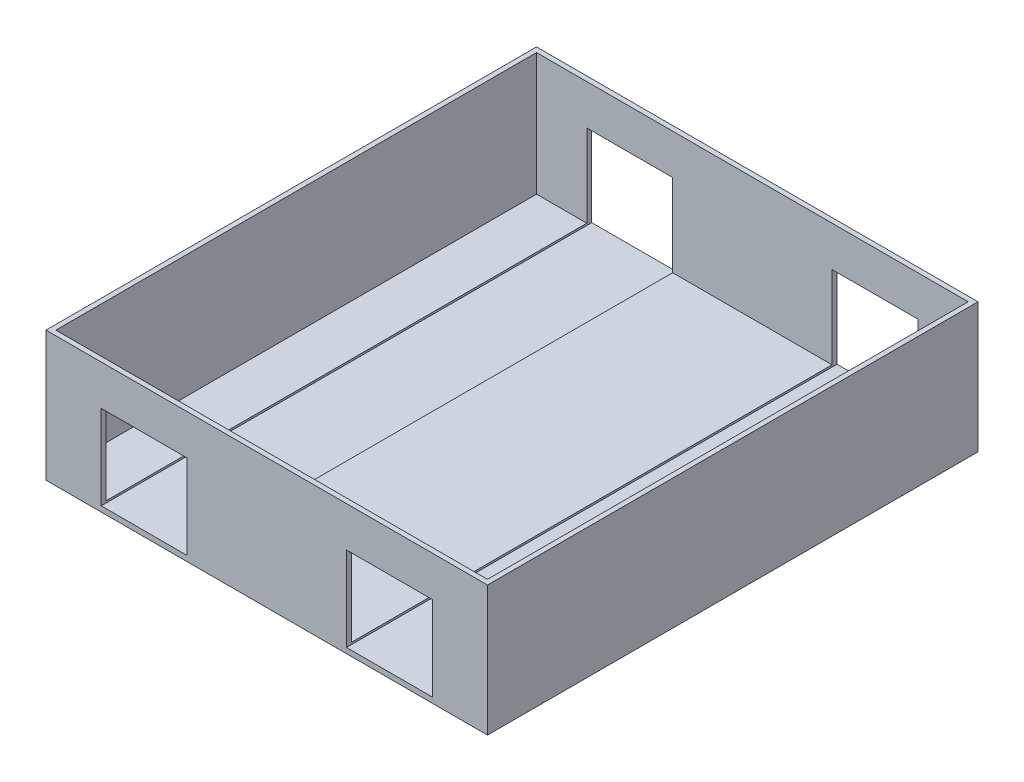
ISO-10303-21;
HEADER;
FILE_DESCRIPTION(('STEP AP214'),'2;1');
FILE_NAME('part.step','',(''),(''),'','','');
FILE_SCHEMA(('AUTOMOTIVE_DESIGN { 1 0 10303 214 1 1 1 1 }'));
ENDSEC;
DATA;
#1=APPLICATION_CONTEXT('core data for automotive mechanical design processes');
#2=APPLICATION_PROTOCOL_DEFINITION('international standard','automotive_design',2000,#1);
#3=PRODUCT_CONTEXT('',#1,'mechanical');
#4=PRODUCT('Part','Part','',(#3));
#5=PRODUCT_RELATED_PRODUCT_CATEGORY('part','',(#4));
#6=PRODUCT_DEFINITION_FORMATION('','',#4);
#7=PRODUCT_DEFINITION_CONTEXT('part definition',#1,'design');
#8=PRODUCT_DEFINITION('design','',#6,#7);
#9=PRODUCT_DEFINITION_SHAPE('','',#8);
#10=(LENGTH_UNIT() NAMED_UNIT(*) SI_UNIT(.MILLI.,.METRE.));
#11=(NAMED_UNIT(*) PLANE_ANGLE_UNIT() SI_UNIT($,.RADIAN.));
#12=(NAMED_UNIT(*) SI_UNIT($,.STERADIAN.) SOLID_ANGLE_UNIT());
#13=UNCERTAINTY_MEASURE_WITH_UNIT(LENGTH_MEASURE(1.E-05),#10,'distance_accuracy_value','');
#14=(GEOMETRIC_REPRESENTATION_CONTEXT(3) GLOBAL_UNCERTAINTY_ASSIGNED_CONTEXT((#13)) GLOBAL_UNIT_ASSIGNED_CONTEXT((#10,
#11,#12)) REPRESENTATION_CONTEXT('',''));
#15=CARTESIAN_POINT('',(0.,0.,0.));
#16=DIRECTION('',(0.,0.,1.));
#17=DIRECTION('',(1.,0.,0.));
#18=AXIS2_PLACEMENT_3D('',#15,#16,#17);
#19=CARTESIAN_POINT('',(-90.,3.,-100.));
#20=DIRECTION('',(0.,0.,1.));
#21=DIRECTION('',(1.,0.,0.));
#22=AXIS2_PLACEMENT_3D('',#19,#20,#21);
#23=PLANE('',#22);
#24=DIRECTION('',(0.,1.,0.));
#25=VECTOR('',#24,1.);
#26=CARTESIAN_POINT('',(67.492549271788,36.6349741182592,-100.));
#27=LINE('',#26,#25);
#28=CARTESIAN_POINT('',(67.492549271788,2.20000000000002,-100.));
#29=VERTEX_POINT('',#28);
#30=CARTESIAN_POINT('',(67.492549271788,36.6349741182592,-100.));
#31=VERTEX_POINT('',#30);
#32=EDGE_CURVE('E63',#29,#31,#27,.T.);
#33=ORIENTED_EDGE('',*,*,#32,.T.);
#34=DIRECTION('',(-1.,0.,0.));
#35=VECTOR('',#34,1.);
#36=CARTESIAN_POINT('',(67.492549271788,36.6349741182592,-100.));
#37=LINE('',#36,#35);
#38=CARTESIAN_POINT('',(32.507450728212,36.6349741182592,-100.));
#39=VERTEX_POINT('',#38);
#40=EDGE_CURVE('E264',#31,#39,#37,.T.);
#41=ORIENTED_EDGE('',*,*,#40,.T.);
#42=DIRECTION('',(0.,-1.,0.));
#43=VECTOR('',#42,1.);
#44=CARTESIAN_POINT('',(32.507450728212,36.6349741182592,-100.));
#45=LINE('',#44,#43);
#46=CARTESIAN_POINT('',(32.507450728212,2.20000000000001,-100.));
#47=VERTEX_POINT('',#46);
#48=EDGE_CURVE('E268',#39,#47,#45,.T.);
#49=ORIENTED_EDGE('',*,*,#48,.T.);
#50=DIRECTION('',(1.,0.,0.));
#51=VECTOR('',#50,1.);
#52=CARTESIAN_POINT('',(67.492549271788,2.20000000000002,-100.));
#53=LINE('',#52,#51);
#54=EDGE_CURVE('E272',#47,#29,#53,.T.);
#55=ORIENTED_EDGE('',*,*,#54,.T.);
#56=EDGE_LOOP('',(#33,#41,#49,#55));
#57=FACE_BOUND('',#56,.T.);
#58=DIRECTION('',(-1.,0.,0.));
#59=VECTOR('',#58,1.);
#60=CARTESIAN_POINT('',(-90.,0.,-100.));
#61=LINE('',#60,#59);
#62=CARTESIAN_POINT('',(90.,0.,-100.));
#63=VERTEX_POINT('',#62);
#64=CARTESIAN_POINT('',(-90.,0.,-100.));
#65=VERTEX_POINT('',#64);
#66=EDGE_CURVE('E406',#63,#65,#61,.T.);
#67=ORIENTED_EDGE('',*,*,#66,.T.);
#68=DIRECTION('',(0.,-1.,0.));
#69=VECTOR('',#68,1.);
#70=CARTESIAN_POINT('',(-90.,3.,-100.));
#71=LINE('',#70,#69);
#72=CARTESIAN_POINT('',(-90.,53.,-100.));
#73=VERTEX_POINT('',#72);
#74=EDGE_CURVE('E423',#73,#65,#71,.T.);
#75=ORIENTED_EDGE('',*,*,#74,.F.);
#76=DIRECTION('',(-1.,0.,0.));
#77=VECTOR('',#76,1.);
#78=CARTESIAN_POINT('',(90.,53.,-100.));
#79=LINE('',#78,#77);
#80=CARTESIAN_POINT('',(90.,53.,-100.));
#81=VERTEX_POINT('',#80);
#82=EDGE_CURVE('E394',#81,#73,#79,.T.);
#83=ORIENTED_EDGE('',*,*,#82,.F.);
#84=DIRECTION('',(0.,-1.,0.));
#85=VECTOR('',#84,1.);
#86=CARTESIAN_POINT('',(90.,3.,-100.));
#87=LINE('',#86,#85);
#88=EDGE_CURVE('E427',#81,#63,#87,.T.);
#89=ORIENTED_EDGE('',*,*,#88,.T.);
#90=EDGE_LOOP('',(#67,#75,#83,#89));
#91=FACE_BOUND('',#90,.T.);
#92=DIRECTION('',(0.,-1.,0.));
#93=VECTOR('',#92,1.);
#94=CARTESIAN_POINT('',(-67.492549271788,36.6349741182592,-100.));
#95=LINE('',#94,#93);
#96=CARTESIAN_POINT('',(-67.492549271788,36.6349741182592,-100.));
#97=VERTEX_POINT('',#96);
#98=CARTESIAN_POINT('',(-67.492549271788,2.2,-100.));
#99=VERTEX_POINT('',#98);
#100=EDGE_CURVE('E55',#97,#99,#95,.T.);
#101=ORIENTED_EDGE('',*,*,#100,.T.);
#102=DIRECTION('',(1.,0.,0.));
#103=VECTOR('',#102,1.);
#104=CARTESIAN_POINT('',(-67.492549271788,2.2,-100.));
#105=LINE('',#104,#103);
#106=CARTESIAN_POINT('',(-32.507450728212,2.2,-100.));
#107=VERTEX_POINT('',#106);
#108=EDGE_CURVE('E214',#99,#107,#105,.T.);
#109=ORIENTED_EDGE('',*,*,#108,.T.);
#110=DIRECTION('',(0.,1.,0.));
#111=VECTOR('',#110,1.);
#112=CARTESIAN_POINT('',(-32.507450728212,36.6349741182592,-100.));
#113=LINE('',#112,#111);
#114=CARTESIAN_POINT('',(-32.507450728212,36.6349741182592,-100.));
#115=VERTEX_POINT('',#114);
#116=EDGE_CURVE('E221',#107,#115,#113,.T.);
#117=ORIENTED_EDGE('',*,*,#116,.T.);
#118=DIRECTION('',(-1.,0.,0.));
#119=VECTOR('',#118,1.);
#120=CARTESIAN_POINT('',(-67.492549271788,36.6349741182592,-100.));
#121=LINE('',#120,#119);
#122=EDGE_CURVE('E225',#115,#97,#121,.T.);
#123=ORIENTED_EDGE('',*,*,#122,.T.);
#124=EDGE_LOOP('',(#101,#109,#117,#123));
#125=FACE_BOUND('',#124,.T.);
#126=ADVANCED_FACE('F39',(#57,#91,#125),#23,.F.);
#127=CARTESIAN_POINT('',(-90.,3.,100.));
#128=DIRECTION('',(0.,0.,-1.));
#129=DIRECTION('',(-1.,0.,0.));
#130=AXIS2_PLACEMENT_3D('',#127,#128,#129);
#131=PLANE('',#130);
#132=DIRECTION('',(0.,1.,0.));
#133=VECTOR('',#132,1.);
#134=CARTESIAN_POINT('',(67.492549271788,36.6349741182592,100.));
#135=LINE('',#134,#133);
#136=CARTESIAN_POINT('',(67.492549271788,2.20000000000002,100.));
#137=VERTEX_POINT('',#136);
#138=CARTESIAN_POINT('',(67.492549271788,36.6349741182592,100.));
#139=VERTEX_POINT('',#138);
#140=EDGE_CURVE('E276',#137,#139,#135,.T.);
#141=ORIENTED_EDGE('',*,*,#140,.F.);
#142=DIRECTION('',(1.,0.,0.));
#143=VECTOR('',#142,1.);
#144=CARTESIAN_POINT('',(67.492549271788,2.20000000000002,100.));
#145=LINE('',#144,#143);
#146=CARTESIAN_POINT('',(32.507450728212,2.20000000000001,100.));
#147=VERTEX_POINT('',#146);
#148=EDGE_CURVE('E286',#147,#137,#145,.T.);
#149=ORIENTED_EDGE('',*,*,#148,.F.);
#150=DIRECTION('',(0.,-1.,0.));
#151=VECTOR('',#150,1.);
#152=CARTESIAN_POINT('',(32.507450728212,36.6349741182592,100.));
#153=LINE('',#152,#151);
#154=CARTESIAN_POINT('',(32.507450728212,36.6349741182592,100.));
#155=VERTEX_POINT('',#154);
#156=EDGE_CURVE('E282',#155,#147,#153,.T.);
#157=ORIENTED_EDGE('',*,*,#156,.F.);
#158=DIRECTION('',(-1.,0.,0.));
#159=VECTOR('',#158,1.);
#160=CARTESIAN_POINT('',(67.492549271788,36.6349741182592,100.));
#161=LINE('',#160,#159);
#162=EDGE_CURVE('E279',#139,#155,#161,.T.);
#163=ORIENTED_EDGE('',*,*,#162,.F.);
#164=EDGE_LOOP('',(#141,#149,#157,#163));
#165=FACE_BOUND('',#164,.T.);
#166=DIRECTION('',(1.,0.,0.));
#167=VECTOR('',#166,1.);
#168=CARTESIAN_POINT('',(-90.,0.,100.));
#169=LINE('',#168,#167);
#170=CARTESIAN_POINT('',(-90.,0.,100.));
#171=VERTEX_POINT('',#170);
#172=CARTESIAN_POINT('',(90.,0.,100.));
#173=VERTEX_POINT('',#172);
#174=EDGE_CURVE('E412',#171,#173,#169,.T.);
#175=ORIENTED_EDGE('',*,*,#174,.T.);
#176=DIRECTION('',(0.,-1.,0.));
#177=VECTOR('',#176,1.);
#178=CARTESIAN_POINT('',(90.,3.,100.));
#179=LINE('',#178,#177);
#180=CARTESIAN_POINT('',(90.,53.,100.));
#181=VERTEX_POINT('',#180);
#182=EDGE_CURVE('E415',#181,#173,#179,.T.);
#183=ORIENTED_EDGE('',*,*,#182,.F.);
#184=DIRECTION('',(1.,0.,0.));
#185=VECTOR('',#184,1.);
#186=CARTESIAN_POINT('',(-90.,53.,100.));
#187=LINE('',#186,#185);
#188=CARTESIAN_POINT('',(-90.,53.,100.));
#189=VERTEX_POINT('',#188);
#190=EDGE_CURVE('E386',#189,#181,#187,.T.);
#191=ORIENTED_EDGE('',*,*,#190,.F.);
#192=DIRECTION('',(0.,-1.,0.));
#193=VECTOR('',#192,1.);
#194=CARTESIAN_POINT('',(-90.,3.,100.));
#195=LINE('',#194,#193);
#196=EDGE_CURVE('E419',#189,#171,#195,.T.);
#197=ORIENTED_EDGE('',*,*,#196,.T.);
#198=EDGE_LOOP('',(#175,#183,#191,#197));
#199=FACE_BOUND('',#198,.T.);
#200=DIRECTION('',(0.,-1.,0.));
#201=VECTOR('',#200,1.);
#202=CARTESIAN_POINT('',(-67.492549271788,36.6349741182592,100.));
#203=LINE('',#202,#201);
#204=CARTESIAN_POINT('',(-67.492549271788,36.6349741182592,100.));
#205=VERTEX_POINT('',#204);
#206=CARTESIAN_POINT('',(-67.492549271788,2.2,100.));
#207=VERTEX_POINT('',#206);
#208=EDGE_CURVE('E206',#205,#207,#203,.T.);
#209=ORIENTED_EDGE('',*,*,#208,.F.);
#210=DIRECTION('',(-1.,0.,0.));
#211=VECTOR('',#210,1.);
#212=CARTESIAN_POINT('',(-67.492549271788,36.6349741182592,100.));
#213=LINE('',#212,#211);
#214=CARTESIAN_POINT('',(-32.507450728212,36.6349741182592,100.));
#215=VERTEX_POINT('',#214);
#216=EDGE_CURVE('E247',#215,#205,#213,.T.);
#217=ORIENTED_EDGE('',*,*,#216,.F.);
#218=DIRECTION('',(0.,1.,0.));
#219=VECTOR('',#218,1.);
#220=CARTESIAN_POINT('',(-32.507450728212,36.6349741182592,100.));
#221=LINE('',#220,#219);
#222=CARTESIAN_POINT('',(-32.507450728212,2.2,100.));
#223=VERTEX_POINT('',#222);
#224=EDGE_CURVE('E243',#223,#215,#221,.T.);
#225=ORIENTED_EDGE('',*,*,#224,.F.);
#226=DIRECTION('',(1.,0.,0.));
#227=VECTOR('',#226,1.);
#228=CARTESIAN_POINT('',(-67.492549271788,2.2,100.));
#229=LINE('',#228,#227);
#230=EDGE_CURVE('E240',#207,#223,#229,.T.);
#231=ORIENTED_EDGE('',*,*,#230,.F.);
#232=EDGE_LOOP('',(#209,#217,#225,#231));
#233=FACE_BOUND('',#232,.T.);
#234=ADVANCED_FACE('F462',(#165,#199,#233),#131,.F.);
#235=CARTESIAN_POINT('',(88.,53.,-98.));
#236=DIRECTION('',(0.,0.,1.));
#237=DIRECTION('',(1.,0.,0.));
#238=AXIS2_PLACEMENT_3D('',#235,#236,#237);
#239=PLANE('',#238);
#240=DIRECTION('',(-1.,0.,0.));
#241=VECTOR('',#240,1.);
#242=CARTESIAN_POINT('',(88.,3.,-98.));
#243=LINE('',#242,#241);
#244=CARTESIAN_POINT('',(-67.492549271788,3.,-98.));
#245=VERTEX_POINT('',#244);
#246=CARTESIAN_POINT('',(-88.,3.,-98.));
#247=VERTEX_POINT('',#246);
#248=EDGE_CURVE('E339',#245,#247,#243,.T.);
#249=ORIENTED_EDGE('',*,*,#248,.F.);
#250=DIRECTION('',(0.,1.,0.));
#251=VECTOR('',#250,1.);
#252=CARTESIAN_POINT('',(-67.492549271788,53.,-98.));
#253=LINE('',#252,#251);
#254=CARTESIAN_POINT('',(-67.492549271788,36.6349741182592,-98.));
#255=VERTEX_POINT('',#254);
#256=EDGE_CURVE('E327',#245,#255,#253,.T.);
#257=ORIENTED_EDGE('',*,*,#256,.T.);
#258=DIRECTION('',(1.,0.,0.));
#259=VECTOR('',#258,1.);
#260=CARTESIAN_POINT('',(88.,36.6349741182592,-98.));
#261=LINE('',#260,#259);
#262=CARTESIAN_POINT('',(-32.507450728212,36.6349741182592,-98.));
#263=VERTEX_POINT('',#262);
#264=EDGE_CURVE('E335',#255,#263,#261,.T.);
#265=ORIENTED_EDGE('',*,*,#264,.T.);
#266=DIRECTION('',(0.,-1.,0.));
#267=VECTOR('',#266,1.);
#268=CARTESIAN_POINT('',(-32.507450728212,53.,-98.));
#269=LINE('',#268,#267);
#270=CARTESIAN_POINT('',(-32.507450728212,3.,-98.));
#271=VERTEX_POINT('',#270);
#272=EDGE_CURVE('E319',#263,#271,#269,.T.);
#273=ORIENTED_EDGE('',*,*,#272,.T.);
#274=CARTESIAN_POINT('',(32.507450728212,3.,-98.));
#275=VERTEX_POINT('',#274);
#276=EDGE_CURVE('E360',#275,#271,#243,.T.);
#277=ORIENTED_EDGE('',*,*,#276,.F.);
#278=DIRECTION('',(0.,1.,0.));
#279=VECTOR('',#278,1.);
#280=CARTESIAN_POINT('',(32.507450728212,53.,-98.));
#281=LINE('',#280,#279);
#282=CARTESIAN_POINT('',(32.507450728212,36.6349741182592,-98.));
#283=VERTEX_POINT('',#282);
#284=EDGE_CURVE('E303',#275,#283,#281,.T.);
#285=ORIENTED_EDGE('',*,*,#284,.T.);
#286=DIRECTION('',(1.,0.,0.));
#287=VECTOR('',#286,1.);
#288=CARTESIAN_POINT('',(88.,36.6349741182592,-98.));
#289=LINE('',#288,#287);
#290=CARTESIAN_POINT('',(67.492549271788,36.6349741182592,-98.));
#291=VERTEX_POINT('',#290);
#292=EDGE_CURVE('E331',#283,#291,#289,.T.);
#293=ORIENTED_EDGE('',*,*,#292,.T.);
#294=DIRECTION('',(0.,-1.,0.));
#295=VECTOR('',#294,1.);
#296=CARTESIAN_POINT('',(67.492549271788,53.,-98.));
#297=LINE('',#296,#295);
#298=CARTESIAN_POINT('',(67.492549271788,3.,-98.));
#299=VERTEX_POINT('',#298);
#300=EDGE_CURVE('E311',#291,#299,#297,.T.);
#301=ORIENTED_EDGE('',*,*,#300,.T.);
#302=CARTESIAN_POINT('',(88.,3.,-98.));
#303=VERTEX_POINT('',#302);
#304=EDGE_CURVE('E355',#303,#299,#243,.T.);
#305=ORIENTED_EDGE('',*,*,#304,.F.);
#306=DIRECTION('',(0.,-1.,0.));
#307=VECTOR('',#306,1.);
#308=CARTESIAN_POINT('',(88.,53.,-98.));
#309=LINE('',#308,#307);
#310=CARTESIAN_POINT('',(88.,53.,-98.));
#311=VERTEX_POINT('',#310);
#312=EDGE_CURVE('E354',#311,#303,#309,.T.);
#313=ORIENTED_EDGE('',*,*,#312,.F.);
#314=DIRECTION('',(-1.,0.,0.));
#315=VECTOR('',#314,1.);
#316=CARTESIAN_POINT('',(88.,53.,-98.));
#317=LINE('',#316,#315);
#318=CARTESIAN_POINT('',(-88.,53.,-98.));
#319=VERTEX_POINT('',#318);
#320=EDGE_CURVE('E340',#311,#319,#317,.T.);
#321=ORIENTED_EDGE('',*,*,#320,.T.);
#322=DIRECTION('',(0.,-1.,0.));
#323=VECTOR('',#322,1.);
#324=CARTESIAN_POINT('',(-88.,53.,-98.));
#325=LINE('',#324,#323);
#326=EDGE_CURVE('E382',#319,#247,#325,.T.);
#327=ORIENTED_EDGE('',*,*,#326,.T.);
#328=EDGE_LOOP('',(#249,#257,#265,#273,#277,#285,#293,#301,#305,#313,#321,#327));
#329=FACE_BOUND('',#328,.T.);
#330=ADVANCED_FACE('F474',(#329),#239,.T.);
#331=CARTESIAN_POINT('',(-88.,53.,98.));
#332=DIRECTION('',(0.,0.,-1.));
#333=DIRECTION('',(-1.,0.,0.));
#334=AXIS2_PLACEMENT_3D('',#331,#332,#333);
#335=PLANE('',#334);
#336=DIRECTION('',(-1.,0.,0.));
#337=VECTOR('',#336,1.);
#338=CARTESIAN_POINT('',(-88.,36.6349741182592,98.));
#339=LINE('',#338,#337);
#340=CARTESIAN_POINT('',(-32.507450728212,36.6349741182592,98.));
#341=VERTEX_POINT('',#340);
#342=CARTESIAN_POINT('',(-67.492549271788,36.6349741182592,98.));
#343=VERTEX_POINT('',#342);
#344=EDGE_CURVE('E11',#341,#343,#339,.T.);
#345=ORIENTED_EDGE('',*,*,#344,.T.);
#346=DIRECTION('',(0.,-1.,0.));
#347=VECTOR('',#346,1.);
#348=CARTESIAN_POINT('',(-67.492549271788,53.,98.));
#349=LINE('',#348,#347);
#350=CARTESIAN_POINT('',(-67.492549271788,3.,98.));
#351=VERTEX_POINT('',#350);
#352=EDGE_CURVE('E323',#343,#351,#349,.T.);
#353=ORIENTED_EDGE('',*,*,#352,.T.);
#354=DIRECTION('',(1.,0.,0.));
#355=VECTOR('',#354,1.);
#356=CARTESIAN_POINT('',(-88.,3.,98.));
#357=LINE('',#356,#355);
#358=CARTESIAN_POINT('',(-88.,3.,98.));
#359=VERTEX_POINT('',#358);
#360=EDGE_CURVE('E364',#359,#351,#357,.T.);
#361=ORIENTED_EDGE('',*,*,#360,.F.);
#362=DIRECTION('',(0.,-1.,0.));
#363=VECTOR('',#362,1.);
#364=CARTESIAN_POINT('',(-88.,53.,98.));
#365=LINE('',#364,#363);
#366=CARTESIAN_POINT('',(-88.,53.,98.));
#367=VERTEX_POINT('',#366);
#368=EDGE_CURVE('E378',#367,#359,#365,.T.);
#369=ORIENTED_EDGE('',*,*,#368,.F.);
#370=DIRECTION('',(1.,0.,0.));
#371=VECTOR('',#370,1.);
#372=CARTESIAN_POINT('',(-88.,53.,98.));
#373=LINE('',#372,#371);
#374=CARTESIAN_POINT('',(88.,53.,98.));
#375=VERTEX_POINT('',#374);
#376=EDGE_CURVE('E347',#367,#375,#373,.T.);
#377=ORIENTED_EDGE('',*,*,#376,.T.);
#378=DIRECTION('',(0.,-1.,0.));
#379=VECTOR('',#378,1.);
#380=CARTESIAN_POINT('',(88.,53.,98.));
#381=LINE('',#380,#379);
#382=CARTESIAN_POINT('',(88.,3.,98.));
#383=VERTEX_POINT('',#382);
#384=EDGE_CURVE('E374',#375,#383,#381,.T.);
#385=ORIENTED_EDGE('',*,*,#384,.T.);
#386=CARTESIAN_POINT('',(67.492549271788,3.,98.));
#387=VERTEX_POINT('',#386);
#388=EDGE_CURVE('E363',#387,#383,#357,.T.);
#389=ORIENTED_EDGE('',*,*,#388,.F.);
#390=DIRECTION('',(0.,1.,0.));
#391=VECTOR('',#390,1.);
#392=CARTESIAN_POINT('',(67.492549271788,53.,98.));
#393=LINE('',#392,#391);
#394=CARTESIAN_POINT('',(67.492549271788,36.6349741182592,98.));
#395=VERTEX_POINT('',#394);
#396=EDGE_CURVE('E307',#387,#395,#393,.T.);
#397=ORIENTED_EDGE('',*,*,#396,.T.);
#398=DIRECTION('',(-1.,0.,0.));
#399=VECTOR('',#398,1.);
#400=CARTESIAN_POINT('',(-88.,36.6349741182592,98.));
#401=LINE('',#400,#399);
#402=CARTESIAN_POINT('',(32.507450728212,36.6349741182592,98.));
#403=VERTEX_POINT('',#402);
#404=EDGE_CURVE('E48',#395,#403,#401,.T.);
#405=ORIENTED_EDGE('',*,*,#404,.T.);
#406=DIRECTION('',(0.,-1.,0.));
#407=VECTOR('',#406,1.);
#408=CARTESIAN_POINT('',(32.507450728212,53.,98.));
#409=LINE('',#408,#407);
#410=CARTESIAN_POINT('',(32.507450728212,3.,98.));
#411=VERTEX_POINT('',#410);
#412=EDGE_CURVE('E210',#403,#411,#409,.T.);
#413=ORIENTED_EDGE('',*,*,#412,.T.);
#414=CARTESIAN_POINT('',(-32.507450728212,3.,98.));
#415=VERTEX_POINT('',#414);
#416=EDGE_CURVE('E368',#415,#411,#357,.T.);
#417=ORIENTED_EDGE('',*,*,#416,.F.);
#418=DIRECTION('',(0.,1.,0.));
#419=VECTOR('',#418,1.);
#420=CARTESIAN_POINT('',(-32.507450728212,53.,98.));
#421=LINE('',#420,#419);
#422=EDGE_CURVE('E315',#415,#341,#421,.T.);
#423=ORIENTED_EDGE('',*,*,#422,.T.);
#424=EDGE_LOOP('',(#345,#353,#361,#369,#377,#385,#389,#397,#405,#413,#417,#423));
#425=FACE_BOUND('',#424,.T.);
#426=ADVANCED_FACE('F449',(#425),#335,.T.);
#427=CARTESIAN_POINT('',(0.,3.,0.));
#428=DIRECTION('',(0.,1.,0.));
#429=DIRECTION('',(0.,0.,1.));
#430=AXIS2_PLACEMENT_3D('',#427,#428,#429);
#431=PLANE('',#430);
#432=ORIENTED_EDGE('',*,*,#360,.T.);
#433=DIRECTION('',(0.,0.,-1.));
#434=VECTOR('',#433,1.);
#435=CARTESIAN_POINT('',(-67.492549271788,3.,0.));
#436=LINE('',#435,#434);
#437=EDGE_CURVE('E443',#351,#245,#436,.T.);
#438=ORIENTED_EDGE('',*,*,#437,.T.);
#439=ORIENTED_EDGE('',*,*,#248,.T.);
#440=DIRECTION('',(0.,0.,1.));
#441=VECTOR('',#440,1.);
#442=CARTESIAN_POINT('',(-88.,3.,-98.));
#443=LINE('',#442,#441);
#444=EDGE_CURVE('E359',#247,#359,#443,.T.);
#445=ORIENTED_EDGE('',*,*,#444,.T.);
#446=EDGE_LOOP('',(#432,#438,#439,#445));
#447=FACE_BOUND('',#446,.T.);
#448=ADVANCED_FACE('F479',(#447),#431,.T.);
#449=ORIENTED_EDGE('',*,*,#276,.T.);
#450=DIRECTION('',(0.,0.,1.));
#451=VECTOR('',#450,1.);
#452=CARTESIAN_POINT('',(-32.507450728212,3.,0.));
#453=LINE('',#452,#451);
#454=EDGE_CURVE('E439',#271,#415,#453,.T.);
#455=ORIENTED_EDGE('',*,*,#454,.T.);
#456=ORIENTED_EDGE('',*,*,#416,.T.);
#457=DIRECTION('',(0.,0.,-1.));
#458=VECTOR('',#457,1.);
#459=CARTESIAN_POINT('',(32.507450728212,3.,0.));
#460=LINE('',#459,#458);
#461=EDGE_CURVE('E431',#411,#275,#460,.T.);
#462=ORIENTED_EDGE('',*,*,#461,.T.);
#463=EDGE_LOOP('',(#449,#455,#456,#462));
#464=FACE_BOUND('',#463,.T.);
#465=ADVANCED_FACE('F471',(#464),#431,.T.);
#466=ORIENTED_EDGE('',*,*,#304,.T.);
#467=DIRECTION('',(0.,0.,1.));
#468=VECTOR('',#467,1.);
#469=CARTESIAN_POINT('',(67.492549271788,3.,0.));
#470=LINE('',#469,#468);
#471=EDGE_CURVE('E435',#299,#387,#470,.T.);
#472=ORIENTED_EDGE('',*,*,#471,.T.);
#473=ORIENTED_EDGE('',*,*,#388,.T.);
#474=DIRECTION('',(0.,0.,-1.));
#475=VECTOR('',#474,1.);
#476=CARTESIAN_POINT('',(88.,3.,98.));
#477=LINE('',#476,#475);
#478=EDGE_CURVE('E344',#383,#303,#477,.T.);
#479=ORIENTED_EDGE('',*,*,#478,.T.);
#480=EDGE_LOOP('',(#466,#472,#473,#479));
#481=FACE_BOUND('',#480,.T.);
#482=ADVANCED_FACE('F535',(#481),#431,.T.);
#483=CARTESIAN_POINT('',(90.,3.,-100.));
#484=DIRECTION('',(-1.,0.,0.));
#485=DIRECTION('',(0.,0.,1.));
#486=AXIS2_PLACEMENT_3D('',#483,#484,#485);
#487=PLANE('',#486);
#488=DIRECTION('',(0.,0.,-1.));
#489=VECTOR('',#488,1.);
#490=CARTESIAN_POINT('',(90.,0.,-100.));
#491=LINE('',#490,#489);
#492=EDGE_CURVE('E402',#173,#63,#491,.T.);
#493=ORIENTED_EDGE('',*,*,#492,.T.);
#494=ORIENTED_EDGE('',*,*,#88,.F.);
#495=DIRECTION('',(0.,0.,-1.));
#496=VECTOR('',#495,1.);
#497=CARTESIAN_POINT('',(90.,53.,100.));
#498=LINE('',#497,#496);
#499=EDGE_CURVE('E390',#181,#81,#498,.T.);
#500=ORIENTED_EDGE('',*,*,#499,.F.);
#501=ORIENTED_EDGE('',*,*,#182,.T.);
#502=EDGE_LOOP('',(#493,#494,#500,#501));
#503=FACE_BOUND('',#502,.T.);
#504=ADVANCED_FACE('F41',(#503),#487,.F.);
#505=CARTESIAN_POINT('',(-90.,3.,-100.));
#506=DIRECTION('',(1.,0.,0.));
#507=DIRECTION('',(0.,0.,-1.));
#508=AXIS2_PLACEMENT_3D('',#505,#506,#507);
#509=PLANE('',#508);
#510=DIRECTION('',(0.,0.,1.));
#511=VECTOR('',#510,1.);
#512=CARTESIAN_POINT('',(-90.,0.,-100.));
#513=LINE('',#512,#511);
#514=EDGE_CURVE('E409',#65,#171,#513,.T.);
#515=ORIENTED_EDGE('',*,*,#514,.T.);
#516=ORIENTED_EDGE('',*,*,#196,.F.);
#517=DIRECTION('',(0.,0.,1.));
#518=VECTOR('',#517,1.);
#519=CARTESIAN_POINT('',(-90.,53.,-100.));
#520=LINE('',#519,#518);
#521=EDGE_CURVE('E398',#73,#189,#520,.T.);
#522=ORIENTED_EDGE('',*,*,#521,.F.);
#523=ORIENTED_EDGE('',*,*,#74,.T.);
#524=EDGE_LOOP('',(#515,#516,#522,#523));
#525=FACE_BOUND('',#524,.T.);
#526=ADVANCED_FACE('F525',(#525),#509,.F.);
#527=CARTESIAN_POINT('',(0.,0.,0.));
#528=DIRECTION('',(0.,1.,0.));
#529=DIRECTION('',(0.,0.,1.));
#530=AXIS2_PLACEMENT_3D('',#527,#528,#529);
#531=PLANE('',#530);
#532=ORIENTED_EDGE('',*,*,#492,.F.);
#533=ORIENTED_EDGE('',*,*,#174,.F.);
#534=ORIENTED_EDGE('',*,*,#514,.F.);
#535=ORIENTED_EDGE('',*,*,#66,.F.);
#536=EDGE_LOOP('',(#532,#533,#534,#535));
#537=FACE_BOUND('',#536,.T.);
#538=ADVANCED_FACE('F527',(#537),#531,.F.);
#539=CARTESIAN_POINT('',(0.,53.,0.));
#540=DIRECTION('',(0.,1.,0.));
#541=DIRECTION('',(0.,0.,1.));
#542=AXIS2_PLACEMENT_3D('',#539,#540,#541);
#543=PLANE('',#542);
#544=ORIENTED_EDGE('',*,*,#190,.T.);
#545=ORIENTED_EDGE('',*,*,#499,.T.);
#546=ORIENTED_EDGE('',*,*,#82,.T.);
#547=ORIENTED_EDGE('',*,*,#521,.T.);
#548=EDGE_LOOP('',(#544,#545,#546,#547));
#549=FACE_BOUND('',#548,.T.);
#550=DIRECTION('',(0.,0.,1.));
#551=VECTOR('',#550,1.);
#552=CARTESIAN_POINT('',(-88.,53.,-98.));
#553=LINE('',#552,#551);
#554=EDGE_CURVE('E343',#319,#367,#553,.T.);
#555=ORIENTED_EDGE('',*,*,#554,.F.);
#556=ORIENTED_EDGE('',*,*,#320,.F.);
#557=DIRECTION('',(0.,0.,-1.));
#558=VECTOR('',#557,1.);
#559=CARTESIAN_POINT('',(88.,53.,98.));
#560=LINE('',#559,#558);
#561=EDGE_CURVE('E351',#375,#311,#560,.T.);
#562=ORIENTED_EDGE('',*,*,#561,.F.);
#563=ORIENTED_EDGE('',*,*,#376,.F.);
#564=EDGE_LOOP('',(#555,#556,#562,#563));
#565=FACE_BOUND('',#564,.T.);
#566=ADVANCED_FACE('F491',(#549,#565),#543,.T.);
#567=CARTESIAN_POINT('',(-88.,53.,-98.));
#568=DIRECTION('',(1.,0.,0.));
#569=DIRECTION('',(0.,0.,-1.));
#570=AXIS2_PLACEMENT_3D('',#567,#568,#569);
#571=PLANE('',#570);
#572=ORIENTED_EDGE('',*,*,#444,.F.);
#573=ORIENTED_EDGE('',*,*,#326,.F.);
#574=ORIENTED_EDGE('',*,*,#554,.T.);
#575=ORIENTED_EDGE('',*,*,#368,.T.);
#576=EDGE_LOOP('',(#572,#573,#574,#575));
#577=FACE_BOUND('',#576,.T.);
#578=ADVANCED_FACE('F482',(#577),#571,.T.);
#579=CARTESIAN_POINT('',(88.,53.,98.));
#580=DIRECTION('',(-1.,0.,0.));
#581=DIRECTION('',(0.,0.,1.));
#582=AXIS2_PLACEMENT_3D('',#579,#580,#581);
#583=PLANE('',#582);
#584=ORIENTED_EDGE('',*,*,#478,.F.);
#585=ORIENTED_EDGE('',*,*,#384,.F.);
#586=ORIENTED_EDGE('',*,*,#561,.T.);
#587=ORIENTED_EDGE('',*,*,#312,.T.);
#588=EDGE_LOOP('',(#584,#585,#586,#587));
#589=FACE_BOUND('',#588,.T.);
#590=ADVANCED_FACE('F543',(#589),#583,.T.);
#591=CARTESIAN_POINT('',(67.492549271788,36.6349741182592,100.));
#592=DIRECTION('',(0.,-1.,0.));
#593=DIRECTION('',(1.,0.,0.));
#594=AXIS2_PLACEMENT_3D('',#591,#592,#593);
#595=PLANE('',#594);
#596=DIRECTION('',(0.,0.,-1.));
#597=VECTOR('',#596,1.);
#598=CARTESIAN_POINT('',(32.507450728212,36.6349741182592,100.));
#599=LINE('',#598,#597);
#600=EDGE_CURVE('E295',#283,#39,#599,.T.);
#601=ORIENTED_EDGE('',*,*,#600,.T.);
#602=ORIENTED_EDGE('',*,*,#40,.F.);
#603=DIRECTION('',(0.,0.,-1.));
#604=VECTOR('',#603,1.);
#605=CARTESIAN_POINT('',(67.492549271788,36.6349741182592,100.));
#606=LINE('',#605,#604);
#607=EDGE_CURVE('E231',#291,#31,#606,.T.);
#608=ORIENTED_EDGE('',*,*,#607,.F.);
#609=ORIENTED_EDGE('',*,*,#292,.F.);
#610=EDGE_LOOP('',(#601,#602,#608,#609));
#611=FACE_BOUND('',#610,.T.);
#612=ADVANCED_FACE('F548',(#611),#595,.T.);
#613=CARTESIAN_POINT('',(67.492549271788,36.6349741182592,100.));
#614=DIRECTION('',(-1.,0.,0.));
#615=DIRECTION('',(0.,0.,1.));
#616=AXIS2_PLACEMENT_3D('',#613,#614,#615);
#617=PLANE('',#616);
#618=ORIENTED_EDGE('',*,*,#607,.T.);
#619=ORIENTED_EDGE('',*,*,#32,.F.);
#620=DIRECTION('',(0.,0.,-1.));
#621=VECTOR('',#620,1.);
#622=CARTESIAN_POINT('',(67.492549271788,2.20000000000002,100.));
#623=LINE('',#622,#621);
#624=EDGE_CURVE('E289',#137,#29,#623,.T.);
#625=ORIENTED_EDGE('',*,*,#624,.F.);
#626=ORIENTED_EDGE('',*,*,#140,.T.);
#627=EDGE_CURVE('E227',#139,#395,#606,.T.);
#628=ORIENTED_EDGE('',*,*,#627,.T.);
#629=ORIENTED_EDGE('',*,*,#396,.F.);
#630=ORIENTED_EDGE('',*,*,#471,.F.);
#631=ORIENTED_EDGE('',*,*,#300,.F.);
#632=EDGE_LOOP('',(#618,#619,#625,#626,#628,#629,#630,#631));
#633=FACE_BOUND('',#632,.T.);
#634=ADVANCED_FACE('F458',(#633),#617,.T.);
#635=ORIENTED_EDGE('',*,*,#627,.F.);
#636=ORIENTED_EDGE('',*,*,#162,.T.);
#637=EDGE_CURVE('E296',#155,#403,#599,.T.);
#638=ORIENTED_EDGE('',*,*,#637,.T.);
#639=ORIENTED_EDGE('',*,*,#404,.F.);
#640=EDGE_LOOP('',(#635,#636,#638,#639));
#641=FACE_BOUND('',#640,.T.);
#642=ADVANCED_FACE('F455',(#641),#595,.T.);
#643=CARTESIAN_POINT('',(32.507450728212,36.6349741182592,100.));
#644=DIRECTION('',(1.,0.,0.));
#645=DIRECTION('',(0.,1.,0.));
#646=AXIS2_PLACEMENT_3D('',#643,#644,#645);
#647=PLANE('',#646);
#648=ORIENTED_EDGE('',*,*,#461,.F.);
#649=ORIENTED_EDGE('',*,*,#412,.F.);
#650=ORIENTED_EDGE('',*,*,#637,.F.);
#651=ORIENTED_EDGE('',*,*,#156,.T.);
#652=DIRECTION('',(0.,0.,-1.));
#653=VECTOR('',#652,1.);
#654=CARTESIAN_POINT('',(32.507450728212,2.20000000000001,100.));
#655=LINE('',#654,#653);
#656=EDGE_CURVE('E292',#147,#47,#655,.T.);
#657=ORIENTED_EDGE('',*,*,#656,.T.);
#658=ORIENTED_EDGE('',*,*,#48,.F.);
#659=ORIENTED_EDGE('',*,*,#600,.F.);
#660=ORIENTED_EDGE('',*,*,#284,.F.);
#661=EDGE_LOOP('',(#648,#649,#650,#651,#657,#658,#659,#660));
#662=FACE_BOUND('',#661,.T.);
#663=ADVANCED_FACE('F466',(#662),#647,.T.);
#664=CARTESIAN_POINT('',(67.492549271788,2.20000000000002,100.));
#665=DIRECTION('',(0.,1.,0.));
#666=DIRECTION('',(-1.,0.,0.));
#667=AXIS2_PLACEMENT_3D('',#664,#665,#666);
#668=PLANE('',#667);
#669=ORIENTED_EDGE('',*,*,#656,.F.);
#670=ORIENTED_EDGE('',*,*,#148,.T.);
#671=ORIENTED_EDGE('',*,*,#624,.T.);
#672=ORIENTED_EDGE('',*,*,#54,.F.);
#673=EDGE_LOOP('',(#669,#670,#671,#672));
#674=FACE_BOUND('',#673,.T.);
#675=ADVANCED_FACE('F506',(#674),#668,.T.);
#676=CARTESIAN_POINT('',(-67.492549271788,36.6349741182592,100.));
#677=DIRECTION('',(0.,-1.,0.));
#678=DIRECTION('',(0.,0.,-1.));
#679=AXIS2_PLACEMENT_3D('',#676,#677,#678);
#680=PLANE('',#679);
#681=DIRECTION('',(0.,0.,-1.));
#682=VECTOR('',#681,1.);
#683=CARTESIAN_POINT('',(-67.492549271788,36.6349741182592,100.));
#684=LINE('',#683,#682);
#685=EDGE_CURVE('E250',#255,#97,#684,.T.);
#686=ORIENTED_EDGE('',*,*,#685,.T.);
#687=ORIENTED_EDGE('',*,*,#122,.F.);
#688=DIRECTION('',(0.,0.,-1.));
#689=VECTOR('',#688,1.);
#690=CARTESIAN_POINT('',(-32.507450728212,36.6349741182592,100.));
#691=LINE('',#690,#689);
#692=EDGE_CURVE('E255',#263,#115,#691,.T.);
#693=ORIENTED_EDGE('',*,*,#692,.F.);
#694=ORIENTED_EDGE('',*,*,#264,.F.);
#695=EDGE_LOOP('',(#686,#687,#693,#694));
#696=FACE_BOUND('',#695,.T.);
#697=ADVANCED_FACE('F503',(#696),#680,.T.);
#698=CARTESIAN_POINT('',(-67.492549271788,36.6349741182592,100.));
#699=DIRECTION('',(1.,0.,0.));
#700=DIRECTION('',(0.,0.,-1.));
#701=AXIS2_PLACEMENT_3D('',#698,#699,#700);
#702=PLANE('',#701);
#703=ORIENTED_EDGE('',*,*,#437,.F.);
#704=ORIENTED_EDGE('',*,*,#352,.F.);
#705=EDGE_CURVE('E251',#205,#343,#684,.T.);
#706=ORIENTED_EDGE('',*,*,#705,.F.);
#707=ORIENTED_EDGE('',*,*,#208,.T.);
#708=DIRECTION('',(0.,0.,-1.));
#709=VECTOR('',#708,1.);
#710=CARTESIAN_POINT('',(-67.492549271788,2.2,100.));
#711=LINE('',#710,#709);
#712=EDGE_CURVE('E201',#207,#99,#711,.T.);
#713=ORIENTED_EDGE('',*,*,#712,.T.);
#714=ORIENTED_EDGE('',*,*,#100,.F.);
#715=ORIENTED_EDGE('',*,*,#685,.F.);
#716=ORIENTED_EDGE('',*,*,#256,.F.);
#717=EDGE_LOOP('',(#703,#704,#706,#707,#713,#714,#715,#716));
#718=FACE_BOUND('',#717,.T.);
#719=ADVANCED_FACE('F203',(#718),#702,.T.);
#720=CARTESIAN_POINT('',(-67.492549271788,2.2,100.));
#721=DIRECTION('',(0.,1.,0.));
#722=DIRECTION('',(-1.,0.,0.));
#723=AXIS2_PLACEMENT_3D('',#720,#721,#722);
#724=PLANE('',#723);
#725=ORIENTED_EDGE('',*,*,#712,.F.);
#726=ORIENTED_EDGE('',*,*,#230,.T.);
#727=DIRECTION('',(0.,0.,-1.));
#728=VECTOR('',#727,1.);
#729=CARTESIAN_POINT('',(-32.507450728212,2.2,100.));
#730=LINE('',#729,#728);
#731=EDGE_CURVE('E211',#223,#107,#730,.T.);
#732=ORIENTED_EDGE('',*,*,#731,.T.);
#733=ORIENTED_EDGE('',*,*,#108,.F.);
#734=EDGE_LOOP('',(#725,#726,#732,#733));
#735=FACE_BOUND('',#734,.T.);
#736=ADVANCED_FACE('F215',(#735),#724,.T.);
#737=CARTESIAN_POINT('',(-32.507450728212,36.6349741182592,100.));
#738=DIRECTION('',(-1.,0.,0.));
#739=DIRECTION('',(0.,-1.,0.));
#740=AXIS2_PLACEMENT_3D('',#737,#738,#739);
#741=PLANE('',#740);
#742=ORIENTED_EDGE('',*,*,#692,.T.);
#743=ORIENTED_EDGE('',*,*,#116,.F.);
#744=ORIENTED_EDGE('',*,*,#731,.F.);
#745=ORIENTED_EDGE('',*,*,#224,.T.);
#746=EDGE_CURVE('E256',#215,#341,#691,.T.);
#747=ORIENTED_EDGE('',*,*,#746,.T.);
#748=ORIENTED_EDGE('',*,*,#422,.F.);
#749=ORIENTED_EDGE('',*,*,#454,.F.);
#750=ORIENTED_EDGE('',*,*,#272,.F.);
#751=EDGE_LOOP('',(#742,#743,#744,#745,#747,#748,#749,#750));
#752=FACE_BOUND('',#751,.T.);
#753=ADVANCED_FACE('F499',(#752),#741,.T.);
#754=ORIENTED_EDGE('',*,*,#746,.F.);
#755=ORIENTED_EDGE('',*,*,#216,.T.);
#756=ORIENTED_EDGE('',*,*,#705,.T.);
#757=ORIENTED_EDGE('',*,*,#344,.F.);
#758=EDGE_LOOP('',(#754,#755,#756,#757));
#759=FACE_BOUND('',#758,.T.);
#760=ADVANCED_FACE('F494',(#759),#680,.T.);
#761=CLOSED_SHELL('',(#126,#234,#330,#426,#448,#465,#482,#504,#526,#538,#566,#578,#590,#612,
#634,#642,#663,#675,#697,#719,#736,#753,#760));
#762=MANIFOLD_SOLID_BREP('B2',#761);
#763=ADVANCED_BREP_SHAPE_REPRESENTATION('',(#18,#762),#14);
#764=SHAPE_DEFINITION_REPRESENTATION(#9,#763);
ENDSEC;
END-ISO-10303-21;
